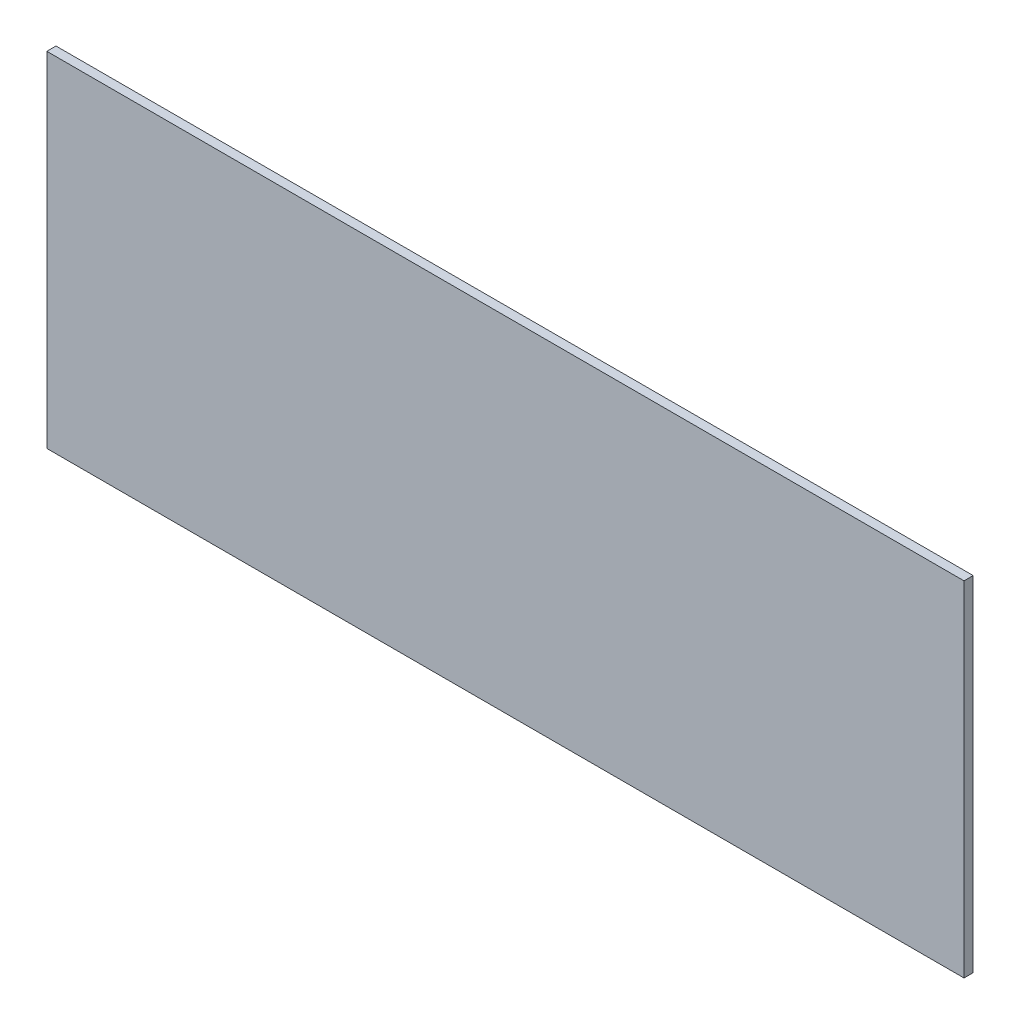
ISO-10303-21;
HEADER;
FILE_DESCRIPTION(('STEP AP214'),'2;1');
FILE_NAME('part.step','',(''),(''),'','','');
FILE_SCHEMA(('AUTOMOTIVE_DESIGN { 1 0 10303 214 1 1 1 1 }'));
ENDSEC;
DATA;
#1=APPLICATION_CONTEXT('core data for automotive mechanical design processes');
#2=APPLICATION_PROTOCOL_DEFINITION('international standard','automotive_design',2000,#1);
#3=PRODUCT_CONTEXT('',#1,'mechanical');
#4=PRODUCT('Part','Part','',(#3));
#5=PRODUCT_RELATED_PRODUCT_CATEGORY('part','',(#4));
#6=PRODUCT_DEFINITION_FORMATION('','',#4);
#7=PRODUCT_DEFINITION_CONTEXT('part definition',#1,'design');
#8=PRODUCT_DEFINITION('design','',#6,#7);
#9=PRODUCT_DEFINITION_SHAPE('','',#8);
#10=(LENGTH_UNIT() NAMED_UNIT(*) SI_UNIT(.MILLI.,.METRE.));
#11=(NAMED_UNIT(*) PLANE_ANGLE_UNIT() SI_UNIT($,.RADIAN.));
#12=(NAMED_UNIT(*) SI_UNIT($,.STERADIAN.) SOLID_ANGLE_UNIT());
#13=UNCERTAINTY_MEASURE_WITH_UNIT(LENGTH_MEASURE(1.E-05),#10,'distance_accuracy_value','');
#14=(GEOMETRIC_REPRESENTATION_CONTEXT(3) GLOBAL_UNCERTAINTY_ASSIGNED_CONTEXT((#13)) GLOBAL_UNIT_ASSIGNED_CONTEXT((#10,
#11,#12)) REPRESENTATION_CONTEXT('',''));
#15=CARTESIAN_POINT('',(0.,0.,0.));
#16=DIRECTION('',(0.,0.,1.));
#17=DIRECTION('',(1.,0.,0.));
#18=AXIS2_PLACEMENT_3D('',#15,#16,#17);
#19=CARTESIAN_POINT('',(0.,0.,4.));
#20=DIRECTION('',(1.,0.,0.));
#21=DIRECTION('',(0.,1.,0.));
#22=AXIS2_PLACEMENT_3D('',#19,#20,#21);
#23=PLANE('',#22);
#24=DIRECTION('',(0.,-1.,0.));
#25=VECTOR('',#24,1.);
#26=CARTESIAN_POINT('',(0.,0.,0.));
#27=LINE('',#26,#25);
#28=CARTESIAN_POINT('',(0.,0.,0.));
#29=VERTEX_POINT('',#28);
#30=CARTESIAN_POINT('',(0.,-150.,0.));
#31=VERTEX_POINT('',#30);
#32=EDGE_CURVE('E100',#29,#31,#27,.T.);
#33=ORIENTED_EDGE('',*,*,#32,.T.);
#34=DIRECTION('',(0.,0.,-1.));
#35=VECTOR('',#34,1.);
#36=CARTESIAN_POINT('',(0.,-150.,4.));
#37=LINE('',#36,#35);
#38=CARTESIAN_POINT('',(0.,-150.,4.));
#39=VERTEX_POINT('',#38);
#40=EDGE_CURVE('E11',#39,#31,#37,.T.);
#41=ORIENTED_EDGE('',*,*,#40,.F.);
#42=DIRECTION('',(0.,-1.,0.));
#43=VECTOR('',#42,1.);
#44=CARTESIAN_POINT('',(0.,0.,4.));
#45=LINE('',#44,#43);
#46=CARTESIAN_POINT('',(0.,0.,4.));
#47=VERTEX_POINT('',#46);
#48=EDGE_CURVE('E88',#47,#39,#45,.T.);
#49=ORIENTED_EDGE('',*,*,#48,.F.);
#50=DIRECTION('',(0.,0.,-1.));
#51=VECTOR('',#50,1.);
#52=CARTESIAN_POINT('',(0.,0.,4.));
#53=LINE('',#52,#51);
#54=EDGE_CURVE('E96',#47,#29,#53,.T.);
#55=ORIENTED_EDGE('',*,*,#54,.T.);
#56=EDGE_LOOP('',(#33,#41,#49,#55));
#57=FACE_BOUND('',#56,.T.);
#58=ADVANCED_FACE('F37',(#57),#23,.F.);
#59=CARTESIAN_POINT('',(0.,-150.,4.));
#60=DIRECTION('',(0.,1.,0.));
#61=DIRECTION('',(0.,0.,1.));
#62=AXIS2_PLACEMENT_3D('',#59,#60,#61);
#63=PLANE('',#62);
#64=DIRECTION('',(1.,0.,0.));
#65=VECTOR('',#64,1.);
#66=CARTESIAN_POINT('',(0.,-150.,0.));
#67=LINE('',#66,#65);
#68=CARTESIAN_POINT('',(400.,-150.,0.));
#69=VERTEX_POINT('',#68);
#70=EDGE_CURVE('E92',#31,#69,#67,.T.);
#71=ORIENTED_EDGE('',*,*,#70,.T.);
#72=DIRECTION('',(0.,0.,-1.));
#73=VECTOR('',#72,1.);
#74=CARTESIAN_POINT('',(400.,-150.,4.));
#75=LINE('',#74,#73);
#76=CARTESIAN_POINT('',(400.,-150.,4.));
#77=VERTEX_POINT('',#76);
#78=EDGE_CURVE('E45',#77,#69,#75,.T.);
#79=ORIENTED_EDGE('',*,*,#78,.F.);
#80=DIRECTION('',(1.,0.,0.));
#81=VECTOR('',#80,1.);
#82=CARTESIAN_POINT('',(0.,-150.,4.));
#83=LINE('',#82,#81);
#84=EDGE_CURVE('E83',#39,#77,#83,.T.);
#85=ORIENTED_EDGE('',*,*,#84,.F.);
#86=ORIENTED_EDGE('',*,*,#40,.T.);
#87=EDGE_LOOP('',(#71,#79,#85,#86));
#88=FACE_BOUND('',#87,.T.);
#89=ADVANCED_FACE('F91',(#88),#63,.F.);
#90=CARTESIAN_POINT('',(400.,0.,4.));
#91=DIRECTION('',(-1.,0.,0.));
#92=DIRECTION('',(0.,0.,1.));
#93=AXIS2_PLACEMENT_3D('',#90,#91,#92);
#94=PLANE('',#93);
#95=DIRECTION('',(0.,1.,0.));
#96=VECTOR('',#95,1.);
#97=CARTESIAN_POINT('',(400.,0.,0.));
#98=LINE('',#97,#96);
#99=CARTESIAN_POINT('',(400.,0.,0.));
#100=VERTEX_POINT('',#99);
#101=EDGE_CURVE('E70',#69,#100,#98,.T.);
#102=ORIENTED_EDGE('',*,*,#101,.T.);
#103=DIRECTION('',(0.,0.,-1.));
#104=VECTOR('',#103,1.);
#105=CARTESIAN_POINT('',(400.,0.,4.));
#106=LINE('',#105,#104);
#107=CARTESIAN_POINT('',(400.,0.,4.));
#108=VERTEX_POINT('',#107);
#109=EDGE_CURVE('E93',#108,#100,#106,.T.);
#110=ORIENTED_EDGE('',*,*,#109,.F.);
#111=DIRECTION('',(0.,1.,0.));
#112=VECTOR('',#111,1.);
#113=CARTESIAN_POINT('',(400.,0.,4.));
#114=LINE('',#113,#112);
#115=EDGE_CURVE('E86',#77,#108,#114,.T.);
#116=ORIENTED_EDGE('',*,*,#115,.F.);
#117=ORIENTED_EDGE('',*,*,#78,.T.);
#118=EDGE_LOOP('',(#102,#110,#116,#117));
#119=FACE_BOUND('',#118,.T.);
#120=ADVANCED_FACE('F94',(#119),#94,.F.);
#121=CARTESIAN_POINT('',(0.,0.,4.));
#122=DIRECTION('',(0.,-1.,0.));
#123=DIRECTION('',(0.,0.,-1.));
#124=AXIS2_PLACEMENT_3D('',#121,#122,#123);
#125=PLANE('',#124);
#126=DIRECTION('',(-1.,0.,0.));
#127=VECTOR('',#126,1.);
#128=CARTESIAN_POINT('',(0.,0.,0.));
#129=LINE('',#128,#127);
#130=EDGE_CURVE('E76',#100,#29,#129,.T.);
#131=ORIENTED_EDGE('',*,*,#130,.T.);
#132=ORIENTED_EDGE('',*,*,#54,.F.);
#133=DIRECTION('',(-1.,0.,0.));
#134=VECTOR('',#133,1.);
#135=CARTESIAN_POINT('',(0.,0.,4.));
#136=LINE('',#135,#134);
#137=EDGE_CURVE('E53',#108,#47,#136,.T.);
#138=ORIENTED_EDGE('',*,*,#137,.F.);
#139=ORIENTED_EDGE('',*,*,#109,.T.);
#140=EDGE_LOOP('',(#131,#132,#138,#139));
#141=FACE_BOUND('',#140,.T.);
#142=ADVANCED_FACE('F107',(#141),#125,.F.);
#143=CARTESIAN_POINT('',(0.,0.,4.));
#144=DIRECTION('',(0.,0.,1.));
#145=DIRECTION('',(1.,0.,0.));
#146=AXIS2_PLACEMENT_3D('',#143,#144,#145);
#147=PLANE('',#146);
#148=ORIENTED_EDGE('',*,*,#48,.T.);
#149=ORIENTED_EDGE('',*,*,#84,.T.);
#150=ORIENTED_EDGE('',*,*,#115,.T.);
#151=ORIENTED_EDGE('',*,*,#137,.T.);
#152=EDGE_LOOP('',(#148,#149,#150,#151));
#153=FACE_BOUND('',#152,.T.);
#154=ADVANCED_FACE('F84',(#153),#147,.T.);
#155=CARTESIAN_POINT('',(0.,0.,0.));
#156=DIRECTION('',(0.,0.,1.));
#157=DIRECTION('',(1.,0.,0.));
#158=AXIS2_PLACEMENT_3D('',#155,#156,#157);
#159=PLANE('',#158);
#160=ORIENTED_EDGE('',*,*,#32,.F.);
#161=ORIENTED_EDGE('',*,*,#130,.F.);
#162=ORIENTED_EDGE('',*,*,#101,.F.);
#163=ORIENTED_EDGE('',*,*,#70,.F.);
#164=EDGE_LOOP('',(#160,#161,#162,#163));
#165=FACE_BOUND('',#164,.T.);
#166=ADVANCED_FACE('F110',(#165),#159,.F.);
#167=CLOSED_SHELL('',(#58,#89,#120,#142,#154,#166));
#168=MANIFOLD_SOLID_BREP('B2',#167);
#169=ADVANCED_BREP_SHAPE_REPRESENTATION('',(#18,#168),#14);
#170=SHAPE_DEFINITION_REPRESENTATION(#9,#169);
ENDSEC;
END-ISO-10303-21;
